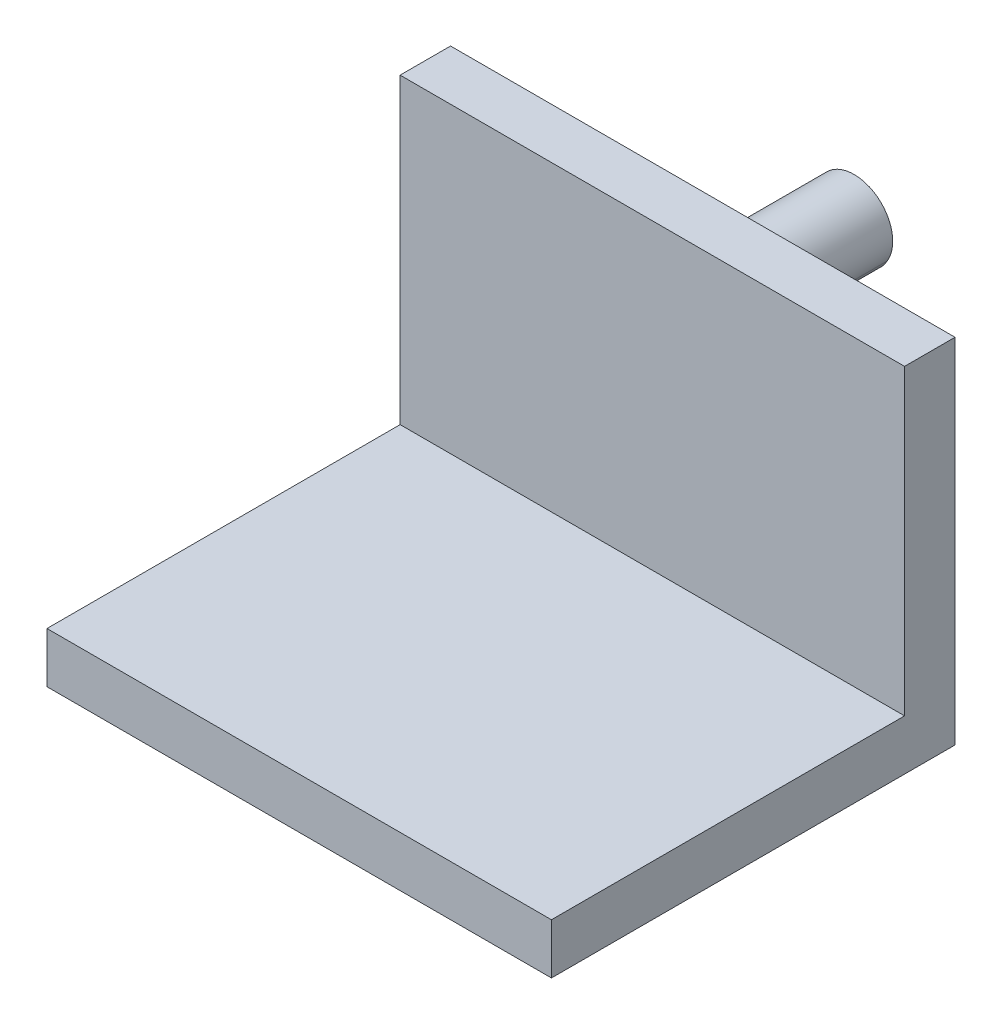
ISO-10303-21;
HEADER;
FILE_DESCRIPTION(('STEP AP214'),'2;1');
FILE_NAME('part.step','',(''),(''),'','','');
FILE_SCHEMA(('AUTOMOTIVE_DESIGN { 1 0 10303 214 1 1 1 1 }'));
ENDSEC;
DATA;
#1=APPLICATION_CONTEXT('core data for automotive mechanical design processes');
#2=APPLICATION_PROTOCOL_DEFINITION('international standard','automotive_design',2000,#1);
#3=PRODUCT_CONTEXT('',#1,'mechanical');
#4=PRODUCT('Part','Part','',(#3));
#5=PRODUCT_RELATED_PRODUCT_CATEGORY('part','',(#4));
#6=PRODUCT_DEFINITION_FORMATION('','',#4);
#7=PRODUCT_DEFINITION_CONTEXT('part definition',#1,'design');
#8=PRODUCT_DEFINITION('design','',#6,#7);
#9=PRODUCT_DEFINITION_SHAPE('','',#8);
#10=(LENGTH_UNIT() NAMED_UNIT(*) SI_UNIT(.MILLI.,.METRE.));
#11=(NAMED_UNIT(*) PLANE_ANGLE_UNIT() SI_UNIT($,.RADIAN.));
#12=(NAMED_UNIT(*) SI_UNIT($,.STERADIAN.) SOLID_ANGLE_UNIT());
#13=UNCERTAINTY_MEASURE_WITH_UNIT(LENGTH_MEASURE(1.E-05),#10,'distance_accuracy_value','');
#14=(GEOMETRIC_REPRESENTATION_CONTEXT(3) GLOBAL_UNCERTAINTY_ASSIGNED_CONTEXT((#13)) GLOBAL_UNIT_ASSIGNED_CONTEXT((#10,
#11,#12)) REPRESENTATION_CONTEXT('',''));
#15=CARTESIAN_POINT('',(0.,0.,0.));
#16=DIRECTION('',(0.,0.,1.));
#17=DIRECTION('',(1.,0.,0.));
#18=AXIS2_PLACEMENT_3D('',#15,#16,#17);
#19=CARTESIAN_POINT('',(0.,15.,-30.));
#20=DIRECTION('',(0.,0.,1.));
#21=DIRECTION('',(1.,0.,0.));
#22=AXIS2_PLACEMENT_3D('',#19,#20,#21);
#23=CYLINDRICAL_SURFACE('',#22,7.5);
#24=DIRECTION('',(0.,0.,1.));
#25=VECTOR('',#24,1.);
#26=CARTESIAN_POINT('',(3.6375000000001,8.44114386878328,-15.));
#27=LINE('',#26,#25);
#28=CARTESIAN_POINT('',(3.6375000000001,8.44114386878328,-30.));
#29=VERTEX_POINT('',#28);
#30=CARTESIAN_POINT('',(3.6375000000001,8.44114386878328,0.));
#31=VERTEX_POINT('',#30);
#32=EDGE_CURVE('E106',#29,#31,#27,.T.);
#33=ORIENTED_EDGE('',*,*,#32,.F.);
#34=CARTESIAN_POINT('',(0.,15.,-30.));
#35=DIRECTION('',(0.,0.,-1.));
#36=DIRECTION('',(-1.,0.,0.));
#37=AXIS2_PLACEMENT_3D('',#34,#35,#36);
#38=CIRCLE('',#37,7.5);
#39=CARTESIAN_POINT('',(6.55885613121674,11.3624999999999,-30.));
#40=VERTEX_POINT('',#39);
#41=EDGE_CURVE('E124',#40,#29,#38,.T.);
#42=ORIENTED_EDGE('',*,*,#41,.F.);
#43=DIRECTION('',(0.,0.,1.));
#44=VECTOR('',#43,1.);
#45=CARTESIAN_POINT('',(6.55885613121674,11.3624999999999,-15.));
#46=LINE('',#45,#44);
#47=CARTESIAN_POINT('',(6.55885613121674,11.3624999999999,0.));
#48=VERTEX_POINT('',#47);
#49=EDGE_CURVE('E119',#48,#40,#46,.F.);
#50=ORIENTED_EDGE('',*,*,#49,.F.);
#51=CARTESIAN_POINT('',(0.,15.,0.));
#52=DIRECTION('',(0.,0.,1.));
#53=DIRECTION('',(1.,0.,0.));
#54=AXIS2_PLACEMENT_3D('',#51,#52,#53);
#55=CIRCLE('',#54,7.5);
#56=EDGE_CURVE('E42',#48,#31,#55,.F.);
#57=ORIENTED_EDGE('',*,*,#56,.T.);
#58=EDGE_LOOP('',(#33,#42,#50,#57));
#59=FACE_BOUND('',#58,.T.);
#60=ADVANCED_FACE('F34',(#59),#23,.T.);
#61=CARTESIAN_POINT('',(0.,15.3,-30.));
#62=DIRECTION('',(0.,0.,1.));
#63=DIRECTION('',(1.,0.,0.));
#64=AXIS2_PLACEMENT_3D('',#61,#62,#63);
#65=CYLINDRICAL_SURFACE('',#64,7.65);
#66=DIRECTION('',(0.,0.,1.));
#67=VECTOR('',#66,1.);
#68=CARTESIAN_POINT('',(-5.55728675030277,20.5572867503028,-15.));
#69=LINE('',#68,#67);
#70=CARTESIAN_POINT('',(-5.55728675030277,20.5572867503028,0.));
#71=VERTEX_POINT('',#70);
#72=CARTESIAN_POINT('',(-5.55728675030277,20.5572867503028,-30.));
#73=VERTEX_POINT('',#72);
#74=EDGE_CURVE('E11',#71,#73,#69,.F.);
#75=ORIENTED_EDGE('',*,*,#74,.F.);
#76=CARTESIAN_POINT('',(0.,15.3,0.));
#77=DIRECTION('',(0.,0.,-1.));
#78=DIRECTION('',(-1.,0.,0.));
#79=AXIS2_PLACEMENT_3D('',#76,#77,#78);
#80=CIRCLE('',#79,7.65);
#81=EDGE_CURVE('E114',#71,#48,#80,.T.);
#82=ORIENTED_EDGE('',*,*,#81,.T.);
#83=ORIENTED_EDGE('',*,*,#49,.T.);
#84=CARTESIAN_POINT('',(0.,15.3,-30.));
#85=DIRECTION('',(0.,0.,-1.));
#86=DIRECTION('',(-1.,0.,0.));
#87=AXIS2_PLACEMENT_3D('',#84,#85,#86);
#88=CIRCLE('',#87,7.65);
#89=EDGE_CURVE('E52',#73,#40,#88,.T.);
#90=ORIENTED_EDGE('',*,*,#89,.F.);
#91=EDGE_LOOP('',(#75,#82,#83,#90));
#92=FACE_BOUND('',#91,.T.);
#93=ADVANCED_FACE('F113',(#92),#65,.T.);
#94=CARTESIAN_POINT('',(0.,35.,10.));
#95=DIRECTION('',(0.,-1.,0.));
#96=DIRECTION('',(1.,0.,0.));
#97=AXIS2_PLACEMENT_3D('',#94,#95,#96);
#98=PLANE('',#97);
#99=DIRECTION('',(-1.,0.,0.));
#100=VECTOR('',#99,1.);
#101=CARTESIAN_POINT('',(0.,35.,0.));
#102=LINE('',#101,#100);
#103=CARTESIAN_POINT('',(50.,35.,0.));
#104=VERTEX_POINT('',#103);
#105=CARTESIAN_POINT('',(-50.,35.,0.));
#106=VERTEX_POINT('',#105);
#107=EDGE_CURVE('E142',#104,#106,#102,.T.);
#108=ORIENTED_EDGE('',*,*,#107,.T.);
#109=DIRECTION('',(0.,0.,-1.));
#110=VECTOR('',#109,1.);
#111=CARTESIAN_POINT('',(-50.,35.,10.));
#112=LINE('',#111,#110);
#113=CARTESIAN_POINT('',(-50.,35.,10.));
#114=VERTEX_POINT('',#113);
#115=EDGE_CURVE('E172',#114,#106,#112,.T.);
#116=ORIENTED_EDGE('',*,*,#115,.F.);
#117=DIRECTION('',(-1.,0.,0.));
#118=VECTOR('',#117,1.);
#119=CARTESIAN_POINT('',(0.,35.,10.));
#120=LINE('',#119,#118);
#121=CARTESIAN_POINT('',(50.,35.,10.));
#122=VERTEX_POINT('',#121);
#123=EDGE_CURVE('E147',#122,#114,#120,.T.);
#124=ORIENTED_EDGE('',*,*,#123,.F.);
#125=DIRECTION('',(0.,0.,-1.));
#126=VECTOR('',#125,1.);
#127=CARTESIAN_POINT('',(50.,35.,10.));
#128=LINE('',#127,#126);
#129=EDGE_CURVE('E156',#122,#104,#128,.T.);
#130=ORIENTED_EDGE('',*,*,#129,.T.);
#131=EDGE_LOOP('',(#108,#116,#124,#130));
#132=FACE_BOUND('',#131,.T.);
#133=ADVANCED_FACE('F36',(#132),#98,.F.);
#134=CARTESIAN_POINT('',(-50.,0.,10.));
#135=DIRECTION('',(1.,0.,0.));
#136=DIRECTION('',(0.,1.,0.));
#137=AXIS2_PLACEMENT_3D('',#134,#135,#136);
#138=PLANE('',#137);
#139=DIRECTION('',(0.,-1.,0.));
#140=VECTOR('',#139,1.);
#141=CARTESIAN_POINT('',(-50.,0.,0.));
#142=LINE('',#141,#140);
#143=CARTESIAN_POINT('',(-50.,-35.,0.));
#144=VERTEX_POINT('',#143);
#145=EDGE_CURVE('E159',#106,#144,#142,.T.);
#146=ORIENTED_EDGE('',*,*,#145,.T.);
#147=DIRECTION('',(0.,0.,-1.));
#148=VECTOR('',#147,1.);
#149=CARTESIAN_POINT('',(-50.,-35.,10.));
#150=LINE('',#149,#148);
#151=CARTESIAN_POINT('',(-50.,-35.,80.));
#152=VERTEX_POINT('',#151);
#153=EDGE_CURVE('E170',#152,#144,#150,.T.);
#154=ORIENTED_EDGE('',*,*,#153,.F.);
#155=DIRECTION('',(0.,1.,0.));
#156=VECTOR('',#155,1.);
#157=CARTESIAN_POINT('',(-50.,-25.,80.));
#158=LINE('',#157,#156);
#159=CARTESIAN_POINT('',(-50.,-25.,80.));
#160=VERTEX_POINT('',#159);
#161=EDGE_CURVE('E126',#152,#160,#158,.T.);
#162=ORIENTED_EDGE('',*,*,#161,.T.);
#163=DIRECTION('',(0.,0.,-1.));
#164=VECTOR('',#163,1.);
#165=CARTESIAN_POINT('',(-50.,-25.,10.));
#166=LINE('',#165,#164);
#167=CARTESIAN_POINT('',(-50.,-25.,10.));
#168=VERTEX_POINT('',#167);
#169=EDGE_CURVE('E131',#160,#168,#166,.T.);
#170=ORIENTED_EDGE('',*,*,#169,.T.);
#171=DIRECTION('',(0.,-1.,0.));
#172=VECTOR('',#171,1.);
#173=CARTESIAN_POINT('',(-50.,0.,10.));
#174=LINE('',#173,#172);
#175=EDGE_CURVE('E150',#114,#168,#174,.T.);
#176=ORIENTED_EDGE('',*,*,#175,.F.);
#177=ORIENTED_EDGE('',*,*,#115,.T.);
#178=EDGE_LOOP('',(#146,#154,#162,#170,#176,#177));
#179=FACE_BOUND('',#178,.T.);
#180=ADVANCED_FACE('F210',(#179),#138,.F.);
#181=CARTESIAN_POINT('',(0.,-35.,10.));
#182=DIRECTION('',(0.,-1.,0.));
#183=DIRECTION('',(1.,0.,0.));
#184=AXIS2_PLACEMENT_3D('',#181,#182,#183);
#185=PLANE('',#184);
#186=DIRECTION('',(-1.,0.,0.));
#187=VECTOR('',#186,1.);
#188=CARTESIAN_POINT('',(0.,-35.,0.));
#189=LINE('',#188,#187);
#190=CARTESIAN_POINT('',(50.,-35.,0.));
#191=VERTEX_POINT('',#190);
#192=EDGE_CURVE('E162',#191,#144,#189,.T.);
#193=ORIENTED_EDGE('',*,*,#192,.F.);
#194=DIRECTION('',(0.,0.,-1.));
#195=VECTOR('',#194,1.);
#196=CARTESIAN_POINT('',(50.,-35.,10.));
#197=LINE('',#196,#195);
#198=CARTESIAN_POINT('',(50.,-35.,80.));
#199=VERTEX_POINT('',#198);
#200=EDGE_CURVE('E168',#199,#191,#197,.T.);
#201=ORIENTED_EDGE('',*,*,#200,.F.);
#202=DIRECTION('',(-1.,0.,0.));
#203=VECTOR('',#202,1.);
#204=CARTESIAN_POINT('',(50.,-35.,80.));
#205=LINE('',#204,#203);
#206=EDGE_CURVE('E134',#199,#152,#205,.T.);
#207=ORIENTED_EDGE('',*,*,#206,.T.);
#208=ORIENTED_EDGE('',*,*,#153,.T.);
#209=EDGE_LOOP('',(#193,#201,#207,#208));
#210=FACE_BOUND('',#209,.T.);
#211=ADVANCED_FACE('F207',(#210),#185,.T.);
#212=CARTESIAN_POINT('',(50.,0.,10.));
#213=DIRECTION('',(1.,0.,0.));
#214=DIRECTION('',(0.,1.,0.));
#215=AXIS2_PLACEMENT_3D('',#212,#213,#214);
#216=PLANE('',#215);
#217=DIRECTION('',(0.,-1.,0.));
#218=VECTOR('',#217,1.);
#219=CARTESIAN_POINT('',(50.,0.,0.));
#220=LINE('',#219,#218);
#221=EDGE_CURVE('E151',#104,#191,#220,.T.);
#222=ORIENTED_EDGE('',*,*,#221,.F.);
#223=ORIENTED_EDGE('',*,*,#129,.F.);
#224=DIRECTION('',(0.,-1.,0.));
#225=VECTOR('',#224,1.);
#226=CARTESIAN_POINT('',(50.,0.,10.));
#227=LINE('',#226,#225);
#228=CARTESIAN_POINT('',(50.,-25.,10.));
#229=VERTEX_POINT('',#228);
#230=EDGE_CURVE('E153',#122,#229,#227,.T.);
#231=ORIENTED_EDGE('',*,*,#230,.T.);
#232=DIRECTION('',(0.,0.,-1.));
#233=VECTOR('',#232,1.);
#234=CARTESIAN_POINT('',(50.,-25.,10.));
#235=LINE('',#234,#233);
#236=CARTESIAN_POINT('',(50.,-25.,80.));
#237=VERTEX_POINT('',#236);
#238=EDGE_CURVE('E130',#237,#229,#235,.T.);
#239=ORIENTED_EDGE('',*,*,#238,.F.);
#240=DIRECTION('',(0.,1.,0.));
#241=VECTOR('',#240,1.);
#242=CARTESIAN_POINT('',(50.,-25.,80.));
#243=LINE('',#242,#241);
#244=EDGE_CURVE('E127',#199,#237,#243,.T.);
#245=ORIENTED_EDGE('',*,*,#244,.F.);
#246=ORIENTED_EDGE('',*,*,#200,.T.);
#247=EDGE_LOOP('',(#222,#223,#231,#239,#245,#246));
#248=FACE_BOUND('',#247,.T.);
#249=ADVANCED_FACE('F201',(#248),#216,.T.);
#250=CARTESIAN_POINT('',(0.,0.,10.));
#251=DIRECTION('',(0.,0.,1.));
#252=DIRECTION('',(1.,0.,0.));
#253=AXIS2_PLACEMENT_3D('',#250,#251,#252);
#254=PLANE('',#253);
#255=DIRECTION('',(-1.,0.,0.));
#256=VECTOR('',#255,1.);
#257=CARTESIAN_POINT('',(50.,-25.,10.));
#258=LINE('',#257,#256);
#259=EDGE_CURVE('E139',#229,#168,#258,.T.);
#260=ORIENTED_EDGE('',*,*,#259,.F.);
#261=ORIENTED_EDGE('',*,*,#230,.F.);
#262=ORIENTED_EDGE('',*,*,#123,.T.);
#263=ORIENTED_EDGE('',*,*,#175,.T.);
#264=EDGE_LOOP('',(#260,#261,#262,#263));
#265=FACE_BOUND('',#264,.T.);
#266=ADVANCED_FACE('F198',(#265),#254,.T.);
#267=CARTESIAN_POINT('',(0.,0.,0.));
#268=DIRECTION('',(0.,0.,1.));
#269=DIRECTION('',(1.,0.,0.));
#270=AXIS2_PLACEMENT_3D('',#267,#268,#269);
#271=PLANE('',#270);
#272=CARTESIAN_POINT('',(-0.299999999999988,15.,0.));
#273=DIRECTION('',(0.,0.,-1.));
#274=DIRECTION('',(-1.,0.,0.));
#275=AXIS2_PLACEMENT_3D('',#272,#273,#274);
#276=CIRCLE('',#275,7.65);
#277=EDGE_CURVE('E102',#31,#71,#276,.T.);
#278=ORIENTED_EDGE('',*,*,#277,.F.);
#279=ORIENTED_EDGE('',*,*,#56,.F.);
#280=ORIENTED_EDGE('',*,*,#81,.F.);
#281=EDGE_LOOP('',(#278,#279,#280));
#282=FACE_BOUND('',#281,.T.);
#283=ORIENTED_EDGE('',*,*,#107,.F.);
#284=ORIENTED_EDGE('',*,*,#221,.T.);
#285=ORIENTED_EDGE('',*,*,#192,.T.);
#286=ORIENTED_EDGE('',*,*,#145,.F.);
#287=EDGE_LOOP('',(#283,#284,#285,#286));
#288=FACE_BOUND('',#287,.T.);
#289=ADVANCED_FACE('F116',(#282,#288),#271,.F.);
#290=CARTESIAN_POINT('',(50.,-25.,10.));
#291=DIRECTION('',(0.,1.,0.));
#292=DIRECTION('',(-1.,0.,0.));
#293=AXIS2_PLACEMENT_3D('',#290,#291,#292);
#294=PLANE('',#293);
#295=ORIENTED_EDGE('',*,*,#169,.F.);
#296=DIRECTION('',(-1.,0.,0.));
#297=VECTOR('',#296,1.);
#298=CARTESIAN_POINT('',(50.,-25.,80.));
#299=LINE('',#298,#297);
#300=EDGE_CURVE('E143',#237,#160,#299,.T.);
#301=ORIENTED_EDGE('',*,*,#300,.F.);
#302=ORIENTED_EDGE('',*,*,#238,.T.);
#303=ORIENTED_EDGE('',*,*,#259,.T.);
#304=EDGE_LOOP('',(#295,#301,#302,#303));
#305=FACE_BOUND('',#304,.T.);
#306=ADVANCED_FACE('F185',(#305),#294,.T.);
#307=CARTESIAN_POINT('',(50.,-25.,80.));
#308=DIRECTION('',(0.,0.,1.));
#309=DIRECTION('',(1.,0.,0.));
#310=AXIS2_PLACEMENT_3D('',#307,#308,#309);
#311=PLANE('',#310);
#312=ORIENTED_EDGE('',*,*,#161,.F.);
#313=ORIENTED_EDGE('',*,*,#206,.F.);
#314=ORIENTED_EDGE('',*,*,#244,.T.);
#315=ORIENTED_EDGE('',*,*,#300,.T.);
#316=EDGE_LOOP('',(#312,#313,#314,#315));
#317=FACE_BOUND('',#316,.T.);
#318=ADVANCED_FACE('F178',(#317),#311,.T.);
#319=CARTESIAN_POINT('',(0.,15.,-30.));
#320=DIRECTION('',(0.,0.,-1.));
#321=DIRECTION('',(-1.,0.,0.));
#322=AXIS2_PLACEMENT_3D('',#319,#320,#321);
#323=PLANE('',#322);
#324=ORIENTED_EDGE('',*,*,#41,.T.);
#325=CARTESIAN_POINT('',(-0.299999999999988,15.,-30.));
#326=DIRECTION('',(0.,0.,-1.));
#327=DIRECTION('',(-1.,0.,0.));
#328=AXIS2_PLACEMENT_3D('',#325,#326,#327);
#329=CIRCLE('',#328,7.65);
#330=EDGE_CURVE('E49',#29,#73,#329,.T.);
#331=ORIENTED_EDGE('',*,*,#330,.T.);
#332=ORIENTED_EDGE('',*,*,#89,.T.);
#333=EDGE_LOOP('',(#324,#331,#332));
#334=FACE_BOUND('',#333,.T.);
#335=ADVANCED_FACE('F176',(#334),#323,.T.);
#336=CARTESIAN_POINT('',(-0.299999999999988,15.,-30.));
#337=DIRECTION('',(0.,0.,1.));
#338=DIRECTION('',(1.,0.,0.));
#339=AXIS2_PLACEMENT_3D('',#336,#337,#338);
#340=CYLINDRICAL_SURFACE('',#339,7.65);
#341=ORIENTED_EDGE('',*,*,#330,.F.);
#342=ORIENTED_EDGE('',*,*,#32,.T.);
#343=ORIENTED_EDGE('',*,*,#277,.T.);
#344=ORIENTED_EDGE('',*,*,#74,.T.);
#345=EDGE_LOOP('',(#341,#342,#343,#344));
#346=FACE_BOUND('',#345,.T.);
#347=ADVANCED_FACE('F104',(#346),#340,.T.);
#348=CLOSED_SHELL('',(#60,#93,#133,#180,#211,#249,#266,#289,#306,#318,#335,#347));
#349=MANIFOLD_SOLID_BREP('B2',#348);
#350=ADVANCED_BREP_SHAPE_REPRESENTATION('',(#18,#349),#14);
#351=SHAPE_DEFINITION_REPRESENTATION(#9,#350);
ENDSEC;
END-ISO-10303-21;
